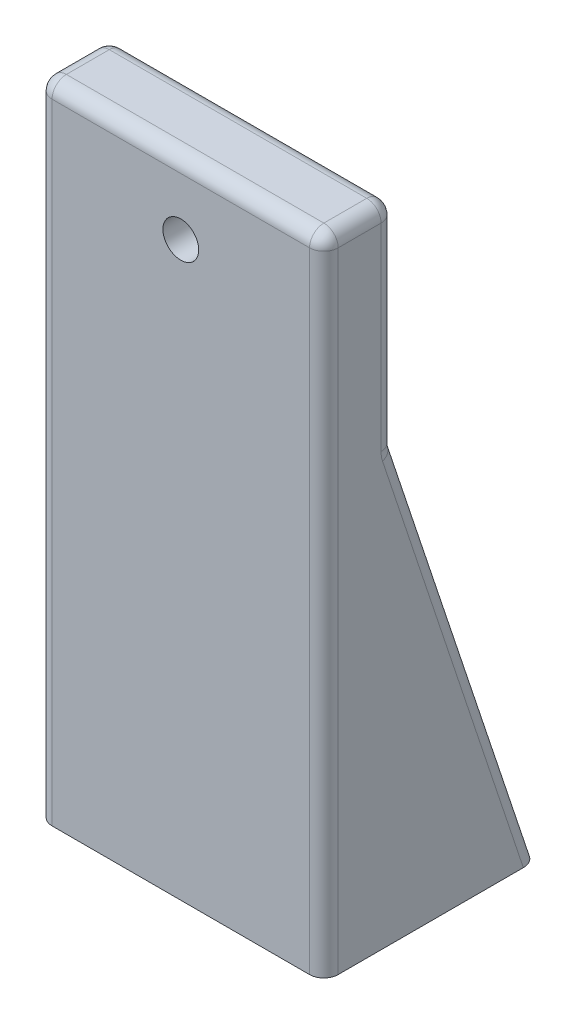
ISO-10303-21;
HEADER;
FILE_DESCRIPTION(('STEP AP214'),'2;1');
FILE_NAME('part.step','',(''),(''),'','','');
FILE_SCHEMA(('AUTOMOTIVE_DESIGN { 1 0 10303 214 1 1 1 1 }'));
ENDSEC;
DATA;
#1=APPLICATION_CONTEXT('core data for automotive mechanical design processes');
#2=APPLICATION_PROTOCOL_DEFINITION('international standard','automotive_design',2000,#1);
#3=PRODUCT_CONTEXT('',#1,'mechanical');
#4=PRODUCT('Part','Part','',(#3));
#5=PRODUCT_RELATED_PRODUCT_CATEGORY('part','',(#4));
#6=PRODUCT_DEFINITION_FORMATION('','',#4);
#7=PRODUCT_DEFINITION_CONTEXT('part definition',#1,'design');
#8=PRODUCT_DEFINITION('design','',#6,#7);
#9=PRODUCT_DEFINITION_SHAPE('','',#8);
#10=(LENGTH_UNIT() NAMED_UNIT(*) SI_UNIT(.MILLI.,.METRE.));
#11=(NAMED_UNIT(*) PLANE_ANGLE_UNIT() SI_UNIT($,.RADIAN.));
#12=(NAMED_UNIT(*) SI_UNIT($,.STERADIAN.) SOLID_ANGLE_UNIT());
#13=UNCERTAINTY_MEASURE_WITH_UNIT(LENGTH_MEASURE(1.E-05),#10,'distance_accuracy_value','');
#14=(GEOMETRIC_REPRESENTATION_CONTEXT(3) GLOBAL_UNCERTAINTY_ASSIGNED_CONTEXT((#13)) GLOBAL_UNIT_ASSIGNED_CONTEXT((#10,
#11,#12)) REPRESENTATION_CONTEXT('',''));
#15=CARTESIAN_POINT('',(0.,0.,0.));
#16=DIRECTION('',(0.,0.,1.));
#17=DIRECTION('',(1.,0.,0.));
#18=AXIS2_PLACEMENT_3D('',#15,#16,#17);
#19=CARTESIAN_POINT('',(0.,0.,6.35));
#20=DIRECTION('',(0.,0.,-1.));
#21=DIRECTION('',(-1.,0.,0.));
#22=AXIS2_PLACEMENT_3D('',#19,#20,#21);
#23=PLANE('',#22);
#24=DIRECTION('',(-1.,0.,0.));
#25=VECTOR('',#24,1.);
#26=CARTESIAN_POINT('',(0.,54.61,6.35));
#27=LINE('',#26,#25);
#28=CARTESIAN_POINT('',(22.86,54.61,6.35));
#29=VERTEX_POINT('',#28);
#30=CARTESIAN_POINT('',(-22.86,54.61,6.35));
#31=VERTEX_POINT('',#30);
#32=EDGE_CURVE('E227',#29,#31,#27,.T.);
#33=ORIENTED_EDGE('',*,*,#32,.T.);
#34=DIRECTION('',(0.,-1.,0.));
#35=VECTOR('',#34,1.);
#36=CARTESIAN_POINT('',(-22.86,0.,6.35));
#37=LINE('',#36,#35);
#38=CARTESIAN_POINT('',(-22.86,-57.15,6.35));
#39=VERTEX_POINT('',#38);
#40=EDGE_CURVE('E230',#31,#39,#37,.T.);
#41=ORIENTED_EDGE('',*,*,#40,.T.);
#42=DIRECTION('',(1.,0.,0.));
#43=VECTOR('',#42,1.);
#44=CARTESIAN_POINT('',(-25.4,-57.15,6.35));
#45=LINE('',#44,#43);
#46=CARTESIAN_POINT('',(22.86,-57.15,6.35));
#47=VERTEX_POINT('',#46);
#48=EDGE_CURVE('E359',#39,#47,#45,.T.);
#49=ORIENTED_EDGE('',*,*,#48,.T.);
#50=DIRECTION('',(0.,1.,0.));
#51=VECTOR('',#50,1.);
#52=CARTESIAN_POINT('',(22.86,0.,6.35));
#53=LINE('',#52,#51);
#54=EDGE_CURVE('E224',#47,#29,#53,.T.);
#55=ORIENTED_EDGE('',*,*,#54,.T.);
#56=EDGE_LOOP('',(#33,#41,#49,#55));
#57=FACE_BOUND('',#56,.T.);
#58=CARTESIAN_POINT('',(0.,44.45,6.35));
#59=DIRECTION('',(0.,0.,1.));
#60=DIRECTION('',(1.,0.,0.));
#61=AXIS2_PLACEMENT_3D('',#58,#59,#60);
#62=CIRCLE('',#61,3.175);
#63=CARTESIAN_POINT('',(3.175,44.45,6.35));
#64=VERTEX_POINT('',#63);
#65=EDGE_CURVE('E355',#64,#64,#62,.T.);
#66=ORIENTED_EDGE('',*,*,#65,.F.);
#67=EDGE_LOOP('',(#66));
#68=FACE_BOUND('',#67,.T.);
#69=ADVANCED_FACE('F44',(#57,#68),#23,.F.);
#70=CARTESIAN_POINT('',(0.,0.,-6.35));
#71=DIRECTION('',(0.,0.,-1.));
#72=DIRECTION('',(-1.,0.,0.));
#73=AXIS2_PLACEMENT_3D('',#70,#71,#72);
#74=PLANE('',#73);
#75=DIRECTION('',(1.,0.,0.));
#76=VECTOR('',#75,1.);
#77=CARTESIAN_POINT('',(-25.4,19.4621852568277,-6.35));
#78=LINE('',#77,#76);
#79=CARTESIAN_POINT('',(22.86,19.4621852568277,-6.35));
#80=VERTEX_POINT('',#79);
#81=CARTESIAN_POINT('',(-22.86,19.4621852568277,-6.35));
#82=VERTEX_POINT('',#81);
#83=EDGE_CURVE('E246',#80,#82,#78,.F.);
#84=ORIENTED_EDGE('',*,*,#83,.T.);
#85=DIRECTION('',(0.,-1.,0.));
#86=VECTOR('',#85,1.);
#87=CARTESIAN_POINT('',(-22.86,57.15,-6.35));
#88=LINE('',#87,#86);
#89=CARTESIAN_POINT('',(-22.86,54.61,-6.35));
#90=VERTEX_POINT('',#89);
#91=EDGE_CURVE('E11',#82,#90,#88,.F.);
#92=ORIENTED_EDGE('',*,*,#91,.T.);
#93=DIRECTION('',(-1.,0.,0.));
#94=VECTOR('',#93,1.);
#95=CARTESIAN_POINT('',(25.4,54.61,-6.35));
#96=LINE('',#95,#94);
#97=CARTESIAN_POINT('',(22.86,54.61,-6.35));
#98=VERTEX_POINT('',#97);
#99=EDGE_CURVE('E54',#90,#98,#96,.F.);
#100=ORIENTED_EDGE('',*,*,#99,.T.);
#101=DIRECTION('',(0.,1.,0.));
#102=VECTOR('',#101,1.);
#103=CARTESIAN_POINT('',(22.86,19.05,-6.35));
#104=LINE('',#103,#102);
#105=EDGE_CURVE('E249',#98,#80,#104,.F.);
#106=ORIENTED_EDGE('',*,*,#105,.T.);
#107=EDGE_LOOP('',(#84,#92,#100,#106));
#108=FACE_BOUND('',#107,.T.);
#109=CARTESIAN_POINT('',(0.,44.45,-6.35));
#110=DIRECTION('',(0.,0.,1.));
#111=DIRECTION('',(1.,0.,0.));
#112=AXIS2_PLACEMENT_3D('',#109,#110,#111);
#113=CIRCLE('',#112,3.175);
#114=CARTESIAN_POINT('',(3.175,44.45,-6.35));
#115=VERTEX_POINT('',#114);
#116=EDGE_CURVE('E171',#115,#115,#113,.T.);
#117=ORIENTED_EDGE('',*,*,#116,.T.);
#118=EDGE_LOOP('',(#117));
#119=FACE_BOUND('',#118,.T.);
#120=ADVANCED_FACE('F384',(#108,#119),#74,.T.);
#121=CARTESIAN_POINT('',(25.4,-57.15,6.35));
#122=DIRECTION('',(-1.,0.,0.));
#123=DIRECTION('',(0.,0.,1.));
#124=AXIS2_PLACEMENT_3D('',#121,#122,#123);
#125=PLANE('',#124);
#126=DIRECTION('',(0.,0.,-1.));
#127=VECTOR('',#126,1.);
#128=CARTESIAN_POINT('',(25.4,54.61,6.35));
#129=LINE('',#128,#127);
#130=CARTESIAN_POINT('',(25.4,54.61,-3.81));
#131=VERTEX_POINT('',#130);
#132=CARTESIAN_POINT('',(25.4,54.61,3.81));
#133=VERTEX_POINT('',#132);
#134=EDGE_CURVE('E211',#131,#133,#129,.F.);
#135=ORIENTED_EDGE('',*,*,#134,.T.);
#136=DIRECTION('',(0.,1.,0.));
#137=VECTOR('',#136,1.);
#138=CARTESIAN_POINT('',(25.4,-57.15,3.81));
#139=LINE('',#138,#137);
#140=CARTESIAN_POINT('',(25.4,-57.15,3.81));
#141=VERTEX_POINT('',#140);
#142=EDGE_CURVE('E221',#133,#141,#139,.F.);
#143=ORIENTED_EDGE('',*,*,#142,.T.);
#144=DIRECTION('',(0.,0.,-1.));
#145=VECTOR('',#144,1.);
#146=CARTESIAN_POINT('',(25.4,-57.15,6.35));
#147=LINE('',#146,#145);
#148=CARTESIAN_POINT('',(25.4,-57.15,-29.0726049143908));
#149=VERTEX_POINT('',#148);
#150=EDGE_CURVE('E366',#141,#149,#147,.T.);
#151=ORIENTED_EDGE('',*,*,#150,.T.);
#152=DIRECTION('',(0.,0.948683298050514,0.316227766016838));
#153=VECTOR('',#152,1.);
#154=CARTESIAN_POINT('',(25.4,18.2467814743172,-3.94034442295169));
#155=LINE('',#154,#153);
#156=CARTESIAN_POINT('',(25.4,17.8557482054622,-4.07068884590338));
#157=VERTEX_POINT('',#156);
#158=EDGE_CURVE('E218',#149,#157,#155,.T.);
#159=ORIENTED_EDGE('',*,*,#158,.T.);
#160=CARTESIAN_POINT('',(25.4,19.4621852568277,-8.89));
#161=DIRECTION('',(-1.,0.,0.));
#162=DIRECTION('',(0.,0.,1.));
#163=AXIS2_PLACEMENT_3D('',#160,#161,#162);
#164=CIRCLE('',#163,5.08);
#165=CARTESIAN_POINT('',(25.4,19.4621852568277,-3.81));
#166=VERTEX_POINT('',#165);
#167=EDGE_CURVE('E214',#166,#157,#164,.F.);
#168=ORIENTED_EDGE('',*,*,#167,.F.);
#169=DIRECTION('',(0.,1.,0.));
#170=VECTOR('',#169,1.);
#171=CARTESIAN_POINT('',(25.4,57.15,-3.81));
#172=LINE('',#171,#170);
#173=EDGE_CURVE('E161',#166,#131,#172,.T.);
#174=ORIENTED_EDGE('',*,*,#173,.T.);
#175=EDGE_LOOP('',(#135,#143,#151,#159,#168,#174));
#176=FACE_BOUND('',#175,.T.);
#177=ADVANCED_FACE('F416',(#176),#125,.F.);
#178=CARTESIAN_POINT('',(-25.4,57.15,6.35));
#179=DIRECTION('',(0.,-1.,0.));
#180=DIRECTION('',(0.,0.,-1.));
#181=AXIS2_PLACEMENT_3D('',#178,#179,#180);
#182=PLANE('',#181);
#183=DIRECTION('',(0.,0.,-1.));
#184=VECTOR('',#183,1.);
#185=CARTESIAN_POINT('',(-22.86,57.15,6.35));
#186=LINE('',#185,#184);
#187=CARTESIAN_POINT('',(-22.86,57.15,-3.81));
#188=VERTEX_POINT('',#187);
#189=CARTESIAN_POINT('',(-22.86,57.15,3.81));
#190=VERTEX_POINT('',#189);
#191=EDGE_CURVE('E239',#188,#190,#186,.F.);
#192=ORIENTED_EDGE('',*,*,#191,.T.);
#193=DIRECTION('',(-1.,0.,0.));
#194=VECTOR('',#193,1.);
#195=CARTESIAN_POINT('',(-25.4,57.15,3.81));
#196=LINE('',#195,#194);
#197=CARTESIAN_POINT('',(22.86,57.15,3.81));
#198=VERTEX_POINT('',#197);
#199=EDGE_CURVE('E243',#190,#198,#196,.F.);
#200=ORIENTED_EDGE('',*,*,#199,.T.);
#201=DIRECTION('',(0.,0.,-1.));
#202=VECTOR('',#201,1.);
#203=CARTESIAN_POINT('',(22.86,57.15,6.35));
#204=LINE('',#203,#202);
#205=CARTESIAN_POINT('',(22.86,57.15,-3.81));
#206=VERTEX_POINT('',#205);
#207=EDGE_CURVE('E236',#198,#206,#204,.T.);
#208=ORIENTED_EDGE('',*,*,#207,.T.);
#209=DIRECTION('',(-1.,0.,0.));
#210=VECTOR('',#209,1.);
#211=CARTESIAN_POINT('',(-25.4,57.15,-3.81));
#212=LINE('',#211,#210);
#213=EDGE_CURVE('E233',#206,#188,#212,.T.);
#214=ORIENTED_EDGE('',*,*,#213,.T.);
#215=EDGE_LOOP('',(#192,#200,#208,#214));
#216=FACE_BOUND('',#215,.T.);
#217=ADVANCED_FACE('F420',(#216),#182,.F.);
#218=CARTESIAN_POINT('',(-25.4,-57.15,6.35));
#219=DIRECTION('',(1.,0.,0.));
#220=DIRECTION('',(0.,0.,-1.));
#221=AXIS2_PLACEMENT_3D('',#218,#219,#220);
#222=PLANE('',#221);
#223=CARTESIAN_POINT('',(-25.4,19.4621852568277,-8.89));
#224=DIRECTION('',(1.,0.,0.));
#225=DIRECTION('',(0.,0.,-1.));
#226=AXIS2_PLACEMENT_3D('',#223,#224,#225);
#227=CIRCLE('',#226,5.08);
#228=CARTESIAN_POINT('',(-25.4,17.8557482054622,-4.07068884590339));
#229=VERTEX_POINT('',#228);
#230=CARTESIAN_POINT('',(-25.4,19.4621852568277,-3.81));
#231=VERTEX_POINT('',#230);
#232=EDGE_CURVE('E179',#229,#231,#227,.F.);
#233=ORIENTED_EDGE('',*,*,#232,.F.);
#234=DIRECTION('',(0.,0.948683298050514,0.316227766016838));
#235=VECTOR('',#234,1.);
#236=CARTESIAN_POINT('',(-25.4,-57.9532185256828,-29.3403444229517));
#237=LINE('',#236,#235);
#238=CARTESIAN_POINT('',(-25.4,-57.15,-29.0726049143908));
#239=VERTEX_POINT('',#238);
#240=EDGE_CURVE('E198',#229,#239,#237,.F.);
#241=ORIENTED_EDGE('',*,*,#240,.T.);
#242=DIRECTION('',(0.,0.,-1.));
#243=VECTOR('',#242,1.);
#244=CARTESIAN_POINT('',(-25.4,-57.15,6.35));
#245=LINE('',#244,#243);
#246=CARTESIAN_POINT('',(-25.4,-57.15,3.81));
#247=VERTEX_POINT('',#246);
#248=EDGE_CURVE('E156',#247,#239,#245,.T.);
#249=ORIENTED_EDGE('',*,*,#248,.F.);
#250=DIRECTION('',(0.,-1.,0.));
#251=VECTOR('',#250,1.);
#252=CARTESIAN_POINT('',(-25.4,-57.15,3.81));
#253=LINE('',#252,#251);
#254=CARTESIAN_POINT('',(-25.4,54.61,3.81));
#255=VERTEX_POINT('',#254);
#256=EDGE_CURVE('E195',#247,#255,#253,.F.);
#257=ORIENTED_EDGE('',*,*,#256,.T.);
#258=DIRECTION('',(0.,0.,-1.));
#259=VECTOR('',#258,1.);
#260=CARTESIAN_POINT('',(-25.4,54.61,6.35));
#261=LINE('',#260,#259);
#262=CARTESIAN_POINT('',(-25.4,54.61,-3.81));
#263=VERTEX_POINT('',#262);
#264=EDGE_CURVE('E192',#255,#263,#261,.T.);
#265=ORIENTED_EDGE('',*,*,#264,.T.);
#266=DIRECTION('',(0.,-1.,0.));
#267=VECTOR('',#266,1.);
#268=CARTESIAN_POINT('',(-25.4,19.05,-3.81));
#269=LINE('',#268,#267);
#270=EDGE_CURVE('E184',#263,#231,#269,.T.);
#271=ORIENTED_EDGE('',*,*,#270,.T.);
#272=EDGE_LOOP('',(#233,#241,#249,#257,#265,#271));
#273=FACE_BOUND('',#272,.T.);
#274=ADVANCED_FACE('F393',(#273),#222,.F.);
#275=CARTESIAN_POINT('',(-25.4,-57.15,6.35));
#276=DIRECTION('',(0.,1.,0.));
#277=DIRECTION('',(0.,0.,1.));
#278=AXIS2_PLACEMENT_3D('',#275,#276,#277);
#279=PLANE('',#278);
#280=CARTESIAN_POINT('',(15.24,-57.15,0.));
#281=DIRECTION('',(0.,-1.,0.));
#282=DIRECTION('',(0.,0.,-1.));
#283=AXIS2_PLACEMENT_3D('',#280,#281,#282);
#284=CIRCLE('',#283,1.5);
#285=CARTESIAN_POINT('',(15.24,-57.15,-1.49999999999999));
#286=VERTEX_POINT('',#285);
#287=EDGE_CURVE('E333',#286,#286,#284,.T.);
#288=ORIENTED_EDGE('',*,*,#287,.F.);
#289=EDGE_LOOP('',(#288));
#290=FACE_BOUND('',#289,.T.);
#291=CARTESIAN_POINT('',(-15.24,-57.15,-22.86));
#292=DIRECTION('',(0.,-1.,0.));
#293=DIRECTION('',(0.,0.,-1.));
#294=AXIS2_PLACEMENT_3D('',#291,#292,#293);
#295=CIRCLE('',#294,1.5);
#296=CARTESIAN_POINT('',(-15.24,-57.15,-24.36));
#297=VERTEX_POINT('',#296);
#298=EDGE_CURVE('E342',#297,#297,#295,.T.);
#299=ORIENTED_EDGE('',*,*,#298,.F.);
#300=EDGE_LOOP('',(#299));
#301=FACE_BOUND('',#300,.T.);
#302=CARTESIAN_POINT('',(15.24,-57.15,-22.86));
#303=DIRECTION('',(0.,-1.,0.));
#304=DIRECTION('',(0.,0.,-1.));
#305=AXIS2_PLACEMENT_3D('',#302,#303,#304);
#306=CIRCLE('',#305,1.5);
#307=CARTESIAN_POINT('',(15.24,-57.15,-24.36));
#308=VERTEX_POINT('',#307);
#309=EDGE_CURVE('E324',#308,#308,#306,.T.);
#310=ORIENTED_EDGE('',*,*,#309,.F.);
#311=EDGE_LOOP('',(#310));
#312=FACE_BOUND('',#311,.T.);
#313=CARTESIAN_POINT('',(-15.24,-57.15,0.));
#314=DIRECTION('',(0.,-1.,0.));
#315=DIRECTION('',(0.,0.,-1.));
#316=AXIS2_PLACEMENT_3D('',#313,#314,#315);
#317=CIRCLE('',#316,1.5);
#318=CARTESIAN_POINT('',(-15.24,-57.15,-1.5));
#319=VERTEX_POINT('',#318);
#320=EDGE_CURVE('E337',#319,#319,#317,.T.);
#321=ORIENTED_EDGE('',*,*,#320,.F.);
#322=EDGE_LOOP('',(#321));
#323=FACE_BOUND('',#322,.T.);
#324=ORIENTED_EDGE('',*,*,#248,.T.);
#325=CARTESIAN_POINT('',(-22.86,-57.15,-29.0726049143908));
#326=DIRECTION('',(0.,1.,0.));
#327=DIRECTION('',(0.,0.,-1.));
#328=AXIS2_PLACEMENT_3D('',#325,#326,#327);
#329=ELLIPSE('',#328,2.67739508560923,2.54);
#330=CARTESIAN_POINT('',(-22.86,-57.15,-31.75));
#331=VERTEX_POINT('',#330);
#332=EDGE_CURVE('E150',#239,#331,#329,.F.);
#333=ORIENTED_EDGE('',*,*,#332,.T.);
#334=DIRECTION('',(1.,0.,0.));
#335=VECTOR('',#334,1.);
#336=CARTESIAN_POINT('',(-25.4,-57.15,-31.75));
#337=LINE('',#336,#335);
#338=CARTESIAN_POINT('',(22.86,-57.15,-31.75));
#339=VERTEX_POINT('',#338);
#340=EDGE_CURVE('E153',#331,#339,#337,.T.);
#341=ORIENTED_EDGE('',*,*,#340,.T.);
#342=CARTESIAN_POINT('',(22.86,-57.15,-29.0726049143908));
#343=DIRECTION('',(0.,1.,0.));
#344=DIRECTION('',(0.,0.,-1.));
#345=AXIS2_PLACEMENT_3D('',#342,#343,#344);
#346=ELLIPSE('',#345,2.67739508560923,2.54);
#347=EDGE_CURVE('E162',#339,#149,#346,.F.);
#348=ORIENTED_EDGE('',*,*,#347,.T.);
#349=ORIENTED_EDGE('',*,*,#150,.F.);
#350=CARTESIAN_POINT('',(22.86,-57.15,3.81));
#351=DIRECTION('',(0.,1.,0.));
#352=DIRECTION('',(0.,0.,1.));
#353=AXIS2_PLACEMENT_3D('',#350,#351,#352);
#354=CIRCLE('',#353,2.54);
#355=EDGE_CURVE('E201',#141,#47,#354,.F.);
#356=ORIENTED_EDGE('',*,*,#355,.T.);
#357=ORIENTED_EDGE('',*,*,#48,.F.);
#358=CARTESIAN_POINT('',(-22.86,-57.15,3.81));
#359=DIRECTION('',(0.,1.,0.));
#360=DIRECTION('',(0.,0.,1.));
#361=AXIS2_PLACEMENT_3D('',#358,#359,#360);
#362=CIRCLE('',#361,2.54);
#363=EDGE_CURVE('E204',#39,#247,#362,.F.);
#364=ORIENTED_EDGE('',*,*,#363,.T.);
#365=EDGE_LOOP('',(#324,#333,#341,#348,#349,#356,#357,#364));
#366=FACE_BOUND('',#365,.T.);
#367=ADVANCED_FACE('F152',(#290,#301,#312,#323,#366),#279,.F.);
#368=CARTESIAN_POINT('',(0.,44.45,6.35));
#369=DIRECTION('',(0.,0.,-1.));
#370=DIRECTION('',(-1.,0.,0.));
#371=AXIS2_PLACEMENT_3D('',#368,#369,#370);
#372=CYLINDRICAL_SURFACE('',#371,3.175);
#373=ORIENTED_EDGE('',*,*,#65,.T.);
#374=EDGE_LOOP('',(#373));
#375=FACE_BOUND('',#374,.T.);
#376=ORIENTED_EDGE('',*,*,#116,.F.);
#377=EDGE_LOOP('',(#376));
#378=FACE_BOUND('',#377,.T.);
#379=ADVANCED_FACE('F445',(#375,#378),#372,.F.);
#380=CARTESIAN_POINT('',(-25.4,-57.15,-31.75));
#381=DIRECTION('',(0.,0.316227766016838,-0.948683298050514));
#382=DIRECTION('',(0.,0.948683298050514,0.316227766016838));
#383=AXIS2_PLACEMENT_3D('',#380,#381,#382);
#384=PLANE('',#383);
#385=ORIENTED_EDGE('',*,*,#340,.F.);
#386=DIRECTION('',(0.,0.948683298050514,0.316227766016838));
#387=VECTOR('',#386,1.);
#388=CARTESIAN_POINT('',(-22.86,19.05,-6.35));
#389=LINE('',#388,#387);
#390=CARTESIAN_POINT('',(-22.86,18.6589667311449,-6.4803444229517));
#391=VERTEX_POINT('',#390);
#392=EDGE_CURVE('E167',#331,#391,#389,.T.);
#393=ORIENTED_EDGE('',*,*,#392,.T.);
#394=DIRECTION('',(1.,0.,0.));
#395=VECTOR('',#394,1.);
#396=CARTESIAN_POINT('',(25.4,18.6589667311449,-6.48034442295169));
#397=LINE('',#396,#395);
#398=CARTESIAN_POINT('',(22.86,18.6589667311449,-6.4803444229517));
#399=VERTEX_POINT('',#398);
#400=EDGE_CURVE('E186',#391,#399,#397,.T.);
#401=ORIENTED_EDGE('',*,*,#400,.T.);
#402=DIRECTION('',(0.,0.948683298050514,0.316227766016838));
#403=VECTOR('',#402,1.);
#404=CARTESIAN_POINT('',(22.86,-57.15,-31.75));
#405=LINE('',#404,#403);
#406=EDGE_CURVE('E169',#399,#339,#405,.F.);
#407=ORIENTED_EDGE('',*,*,#406,.T.);
#408=EDGE_LOOP('',(#385,#393,#401,#407));
#409=FACE_BOUND('',#408,.T.);
#410=ADVANCED_FACE('F166',(#409),#384,.T.);
#411=CARTESIAN_POINT('',(-15.24,-44.45,0.));
#412=DIRECTION('',(0.,-1.,0.));
#413=DIRECTION('',(0.,0.,-1.));
#414=AXIS2_PLACEMENT_3D('',#411,#412,#413);
#415=CYLINDRICAL_SURFACE('',#414,1.5);
#416=CARTESIAN_POINT('',(-15.24,-44.45,0.));
#417=DIRECTION('',(0.,-1.,0.));
#418=DIRECTION('',(0.,0.,-1.));
#419=AXIS2_PLACEMENT_3D('',#416,#417,#418);
#420=CIRCLE('',#419,1.5);
#421=CARTESIAN_POINT('',(-15.24,-44.45,-1.5));
#422=VERTEX_POINT('',#421);
#423=EDGE_CURVE('E172',#422,#422,#420,.T.);
#424=ORIENTED_EDGE('',*,*,#423,.F.);
#425=EDGE_LOOP('',(#424));
#426=FACE_BOUND('',#425,.T.);
#427=ORIENTED_EDGE('',*,*,#320,.T.);
#428=EDGE_LOOP('',(#427));
#429=FACE_BOUND('',#428,.T.);
#430=ADVANCED_FACE('F644',(#426,#429),#415,.F.);
#431=CARTESIAN_POINT('',(-15.24,-44.45,0.));
#432=DIRECTION('',(0.,-1.,0.));
#433=DIRECTION('',(0.,0.,-1.));
#434=AXIS2_PLACEMENT_3D('',#431,#432,#433);
#435=PLANE('',#434);
#436=ORIENTED_EDGE('',*,*,#423,.T.);
#437=EDGE_LOOP('',(#436));
#438=FACE_BOUND('',#437,.T.);
#439=ADVANCED_FACE('F635',(#438),#435,.T.);
#440=CARTESIAN_POINT('',(15.24,-44.45,-22.86));
#441=DIRECTION('',(0.,-1.,0.));
#442=DIRECTION('',(0.,0.,-1.));
#443=AXIS2_PLACEMENT_3D('',#440,#441,#442);
#444=CYLINDRICAL_SURFACE('',#443,1.5);
#445=CARTESIAN_POINT('',(15.24,-44.45,-22.86));
#446=DIRECTION('',(0.,-1.,0.));
#447=DIRECTION('',(0.,0.,-1.));
#448=AXIS2_PLACEMENT_3D('',#445,#446,#447);
#449=CIRCLE('',#448,1.5);
#450=CARTESIAN_POINT('',(15.24,-44.45,-24.36));
#451=VERTEX_POINT('',#450);
#452=EDGE_CURVE('E318',#451,#451,#449,.T.);
#453=ORIENTED_EDGE('',*,*,#452,.F.);
#454=EDGE_LOOP('',(#453));
#455=FACE_BOUND('',#454,.T.);
#456=ORIENTED_EDGE('',*,*,#309,.T.);
#457=EDGE_LOOP('',(#456));
#458=FACE_BOUND('',#457,.T.);
#459=ADVANCED_FACE('F627',(#455,#458),#444,.F.);
#460=CARTESIAN_POINT('',(15.24,-44.45,-22.86));
#461=DIRECTION('',(0.,-1.,0.));
#462=DIRECTION('',(0.,0.,-1.));
#463=AXIS2_PLACEMENT_3D('',#460,#461,#462);
#464=PLANE('',#463);
#465=ORIENTED_EDGE('',*,*,#452,.T.);
#466=EDGE_LOOP('',(#465));
#467=FACE_BOUND('',#466,.T.);
#468=ADVANCED_FACE('F618',(#467),#464,.T.);
#469=CARTESIAN_POINT('',(-15.24,-44.45,-22.86));
#470=DIRECTION('',(0.,-1.,0.));
#471=DIRECTION('',(0.,0.,-1.));
#472=AXIS2_PLACEMENT_3D('',#469,#470,#471);
#473=CYLINDRICAL_SURFACE('',#472,1.5);
#474=CARTESIAN_POINT('',(-15.24,-44.45,-22.86));
#475=DIRECTION('',(0.,-1.,0.));
#476=DIRECTION('',(0.,0.,-1.));
#477=AXIS2_PLACEMENT_3D('',#474,#475,#476);
#478=CIRCLE('',#477,1.5);
#479=CARTESIAN_POINT('',(-15.24,-44.45,-24.36));
#480=VERTEX_POINT('',#479);
#481=EDGE_CURVE('E330',#480,#480,#478,.T.);
#482=ORIENTED_EDGE('',*,*,#481,.F.);
#483=EDGE_LOOP('',(#482));
#484=FACE_BOUND('',#483,.T.);
#485=ORIENTED_EDGE('',*,*,#298,.T.);
#486=EDGE_LOOP('',(#485));
#487=FACE_BOUND('',#486,.T.);
#488=ADVANCED_FACE('F609',(#484,#487),#473,.F.);
#489=CARTESIAN_POINT('',(-15.24,-44.45,-22.86));
#490=DIRECTION('',(0.,-1.,0.));
#491=DIRECTION('',(0.,0.,-1.));
#492=AXIS2_PLACEMENT_3D('',#489,#490,#491);
#493=PLANE('',#492);
#494=ORIENTED_EDGE('',*,*,#481,.T.);
#495=EDGE_LOOP('',(#494));
#496=FACE_BOUND('',#495,.T.);
#497=ADVANCED_FACE('F600',(#496),#493,.T.);
#498=CARTESIAN_POINT('',(15.24,-44.45,0.));
#499=DIRECTION('',(0.,-1.,0.));
#500=DIRECTION('',(0.,0.,-1.));
#501=AXIS2_PLACEMENT_3D('',#498,#499,#500);
#502=CYLINDRICAL_SURFACE('',#501,1.5);
#503=CARTESIAN_POINT('',(15.24,-44.45,0.));
#504=DIRECTION('',(0.,-1.,0.));
#505=DIRECTION('',(0.,0.,-1.));
#506=AXIS2_PLACEMENT_3D('',#503,#504,#505);
#507=CIRCLE('',#506,1.5);
#508=CARTESIAN_POINT('',(15.24,-44.45,-1.49999999999999));
#509=VERTEX_POINT('',#508);
#510=EDGE_CURVE('E338',#509,#509,#507,.T.);
#511=ORIENTED_EDGE('',*,*,#510,.F.);
#512=EDGE_LOOP('',(#511));
#513=FACE_BOUND('',#512,.T.);
#514=ORIENTED_EDGE('',*,*,#287,.T.);
#515=EDGE_LOOP('',(#514));
#516=FACE_BOUND('',#515,.T.);
#517=ADVANCED_FACE('F591',(#513,#516),#502,.F.);
#518=CARTESIAN_POINT('',(15.24,-44.45,0.));
#519=DIRECTION('',(0.,-1.,0.));
#520=DIRECTION('',(0.,0.,-1.));
#521=AXIS2_PLACEMENT_3D('',#518,#519,#520);
#522=PLANE('',#521);
#523=ORIENTED_EDGE('',*,*,#510,.T.);
#524=EDGE_LOOP('',(#523));
#525=FACE_BOUND('',#524,.T.);
#526=ADVANCED_FACE('F433',(#525),#522,.T.);
#527=CARTESIAN_POINT('',(22.86,0.,3.81));
#528=DIRECTION('',(0.,1.,0.));
#529=DIRECTION('',(0.,0.,1.));
#530=AXIS2_PLACEMENT_3D('',#527,#528,#529);
#531=CYLINDRICAL_SURFACE('',#530,2.54);
#532=CARTESIAN_POINT('',(22.86,54.61,3.81));
#533=DIRECTION('',(0.,1.,0.));
#534=DIRECTION('',(0.,0.,1.));
#535=AXIS2_PLACEMENT_3D('',#532,#533,#534);
#536=CIRCLE('',#535,2.54);
#537=EDGE_CURVE('E48',#29,#133,#536,.T.);
#538=ORIENTED_EDGE('',*,*,#537,.F.);
#539=ORIENTED_EDGE('',*,*,#54,.F.);
#540=ORIENTED_EDGE('',*,*,#355,.F.);
#541=ORIENTED_EDGE('',*,*,#142,.F.);
#542=EDGE_LOOP('',(#538,#539,#540,#541));
#543=FACE_BOUND('',#542,.T.);
#544=ADVANCED_FACE('F46',(#543),#531,.T.);
#545=CARTESIAN_POINT('',(22.86,54.61,3.81));
#546=DIRECTION('',(1.,0.,0.));
#547=DIRECTION('',(0.,0.,-1.));
#548=AXIS2_PLACEMENT_3D('',#545,#546,#547);
#549=SPHERICAL_SURFACE('',#548,2.54);
#550=CARTESIAN_POINT('',(22.86,54.61,3.81));
#551=DIRECTION('',(1.,0.,0.));
#552=DIRECTION('',(0.,0.,-1.));
#553=AXIS2_PLACEMENT_3D('',#550,#551,#552);
#554=CIRCLE('',#553,2.54);
#555=EDGE_CURVE('E306',#29,#198,#554,.F.);
#556=ORIENTED_EDGE('',*,*,#555,.F.);
#557=ORIENTED_EDGE('',*,*,#537,.T.);
#558=CARTESIAN_POINT('',(22.86,54.61,3.81));
#559=DIRECTION('',(0.,0.,1.));
#560=DIRECTION('',(1.,0.,0.));
#561=AXIS2_PLACEMENT_3D('',#558,#559,#560);
#562=CIRCLE('',#561,2.54);
#563=EDGE_CURVE('E309',#198,#133,#562,.F.);
#564=ORIENTED_EDGE('',*,*,#563,.F.);
#565=EDGE_LOOP('',(#556,#557,#564));
#566=FACE_BOUND('',#565,.T.);
#567=ADVANCED_FACE('F426',(#566),#549,.T.);
#568=CARTESIAN_POINT('',(22.86,54.61,6.35));
#569=DIRECTION('',(0.,0.,-1.));
#570=DIRECTION('',(-1.,0.,0.));
#571=AXIS2_PLACEMENT_3D('',#568,#569,#570);
#572=CYLINDRICAL_SURFACE('',#571,2.54);
#573=ORIENTED_EDGE('',*,*,#563,.T.);
#574=ORIENTED_EDGE('',*,*,#134,.F.);
#575=CARTESIAN_POINT('',(22.86,54.61,-3.81));
#576=DIRECTION('',(0.,0.,-1.));
#577=DIRECTION('',(-1.,0.,0.));
#578=AXIS2_PLACEMENT_3D('',#575,#576,#577);
#579=CIRCLE('',#578,2.54);
#580=EDGE_CURVE('E302',#206,#131,#579,.T.);
#581=ORIENTED_EDGE('',*,*,#580,.F.);
#582=ORIENTED_EDGE('',*,*,#207,.F.);
#583=EDGE_LOOP('',(#573,#574,#581,#582));
#584=FACE_BOUND('',#583,.T.);
#585=ADVANCED_FACE('F418',(#584),#572,.T.);
#586=CARTESIAN_POINT('',(0.,54.61,3.81));
#587=DIRECTION('',(-1.,0.,0.));
#588=DIRECTION('',(0.,0.,1.));
#589=AXIS2_PLACEMENT_3D('',#586,#587,#588);
#590=CYLINDRICAL_SURFACE('',#589,2.54);
#591=ORIENTED_EDGE('',*,*,#555,.T.);
#592=ORIENTED_EDGE('',*,*,#199,.F.);
#593=CARTESIAN_POINT('',(-22.86,54.61,3.81));
#594=DIRECTION('',(-1.,0.,0.));
#595=DIRECTION('',(0.,0.,1.));
#596=AXIS2_PLACEMENT_3D('',#593,#594,#595);
#597=CIRCLE('',#596,2.54);
#598=EDGE_CURVE('E298',#31,#190,#597,.T.);
#599=ORIENTED_EDGE('',*,*,#598,.F.);
#600=ORIENTED_EDGE('',*,*,#32,.F.);
#601=EDGE_LOOP('',(#591,#592,#599,#600));
#602=FACE_BOUND('',#601,.T.);
#603=ADVANCED_FACE('F425',(#602),#590,.T.);
#604=CARTESIAN_POINT('',(-22.86,0.,3.81));
#605=DIRECTION('',(0.,-1.,0.));
#606=DIRECTION('',(0.,0.,-1.));
#607=AXIS2_PLACEMENT_3D('',#604,#605,#606);
#608=CYLINDRICAL_SURFACE('',#607,2.54);
#609=ORIENTED_EDGE('',*,*,#363,.F.);
#610=ORIENTED_EDGE('',*,*,#40,.F.);
#611=CARTESIAN_POINT('',(-22.86,54.61,3.81));
#612=DIRECTION('',(0.,1.,0.));
#613=DIRECTION('',(0.,0.,1.));
#614=AXIS2_PLACEMENT_3D('',#611,#612,#613);
#615=CIRCLE('',#614,2.54);
#616=EDGE_CURVE('E294',#255,#31,#615,.T.);
#617=ORIENTED_EDGE('',*,*,#616,.F.);
#618=ORIENTED_EDGE('',*,*,#256,.F.);
#619=EDGE_LOOP('',(#609,#610,#617,#618));
#620=FACE_BOUND('',#619,.T.);
#621=ADVANCED_FACE('F483',(#620),#608,.T.);
#622=CARTESIAN_POINT('',(22.86,54.61,-3.81));
#623=DIRECTION('',(1.,0.,0.));
#624=DIRECTION('',(0.,0.,-1.));
#625=AXIS2_PLACEMENT_3D('',#622,#623,#624);
#626=SPHERICAL_SURFACE('',#625,2.54);
#627=CARTESIAN_POINT('',(22.86,54.61,-3.81));
#628=DIRECTION('',(1.,0.,0.));
#629=DIRECTION('',(0.,0.,-1.));
#630=AXIS2_PLACEMENT_3D('',#627,#628,#629);
#631=CIRCLE('',#630,2.54);
#632=EDGE_CURVE('E287',#206,#98,#631,.F.);
#633=ORIENTED_EDGE('',*,*,#632,.F.);
#634=ORIENTED_EDGE('',*,*,#580,.T.);
#635=CARTESIAN_POINT('',(22.86,54.61,-3.81));
#636=DIRECTION('',(0.,1.,0.));
#637=DIRECTION('',(0.,0.,1.));
#638=AXIS2_PLACEMENT_3D('',#635,#636,#637);
#639=CIRCLE('',#638,2.54);
#640=EDGE_CURVE('E290',#98,#131,#639,.F.);
#641=ORIENTED_EDGE('',*,*,#640,.F.);
#642=EDGE_LOOP('',(#633,#634,#641));
#643=FACE_BOUND('',#642,.T.);
#644=ADVANCED_FACE('F410',(#643),#626,.T.);
#645=CARTESIAN_POINT('',(-22.86,54.61,3.81));
#646=DIRECTION('',(0.,0.,1.));
#647=DIRECTION('',(1.,0.,0.));
#648=AXIS2_PLACEMENT_3D('',#645,#646,#647);
#649=SPHERICAL_SURFACE('',#648,2.54);
#650=ORIENTED_EDGE('',*,*,#616,.T.);
#651=ORIENTED_EDGE('',*,*,#598,.T.);
#652=CARTESIAN_POINT('',(-22.86,54.61,3.81));
#653=DIRECTION('',(0.,0.,1.));
#654=DIRECTION('',(1.,0.,0.));
#655=AXIS2_PLACEMENT_3D('',#652,#653,#654);
#656=CIRCLE('',#655,2.54);
#657=EDGE_CURVE('E284',#255,#190,#656,.F.);
#658=ORIENTED_EDGE('',*,*,#657,.F.);
#659=EDGE_LOOP('',(#650,#651,#658));
#660=FACE_BOUND('',#659,.T.);
#661=ADVANCED_FACE('F477',(#660),#649,.T.);
#662=CARTESIAN_POINT('',(22.86,-46.5232185256828,-25.5303444229517));
#663=DIRECTION('',(0.,-0.948683298050514,-0.316227766016838));
#664=DIRECTION('',(0.,0.316227766016838,-0.948683298050514));
#665=AXIS2_PLACEMENT_3D('',#662,#663,#664);
#666=CYLINDRICAL_SURFACE('',#665,2.54);
#667=ORIENTED_EDGE('',*,*,#347,.F.);
#668=ORIENTED_EDGE('',*,*,#406,.F.);
#669=CARTESIAN_POINT('',(22.86,17.8557482054622,-4.07068884590338));
#670=DIRECTION('',(0.,0.948683298050514,0.316227766016839));
#671=DIRECTION('',(0.,-0.316227766016839,0.948683298050514));
#672=AXIS2_PLACEMENT_3D('',#669,#670,#671);
#673=CIRCLE('',#672,2.54);
#674=EDGE_CURVE('E280',#157,#399,#673,.T.);
#675=ORIENTED_EDGE('',*,*,#674,.F.);
#676=ORIENTED_EDGE('',*,*,#158,.F.);
#677=EDGE_LOOP('',(#667,#668,#675,#676));
#678=FACE_BOUND('',#677,.T.);
#679=ADVANCED_FACE('F377',(#678),#666,.T.);
#680=CARTESIAN_POINT('',(22.86,-57.15,-3.81));
#681=DIRECTION('',(0.,-1.,0.));
#682=DIRECTION('',(0.,0.,-1.));
#683=AXIS2_PLACEMENT_3D('',#680,#681,#682);
#684=CYLINDRICAL_SURFACE('',#683,2.54);
#685=ORIENTED_EDGE('',*,*,#640,.T.);
#686=ORIENTED_EDGE('',*,*,#173,.F.);
#687=CARTESIAN_POINT('',(22.86,19.4621852568277,-3.81));
#688=DIRECTION('',(0.,-1.,0.));
#689=DIRECTION('',(0.,0.,-1.));
#690=AXIS2_PLACEMENT_3D('',#687,#688,#689);
#691=CIRCLE('',#690,2.54);
#692=EDGE_CURVE('E276',#80,#166,#691,.T.);
#693=ORIENTED_EDGE('',*,*,#692,.F.);
#694=ORIENTED_EDGE('',*,*,#105,.F.);
#695=EDGE_LOOP('',(#685,#686,#693,#694));
#696=FACE_BOUND('',#695,.T.);
#697=ADVANCED_FACE('F414',(#696),#684,.T.);
#698=CARTESIAN_POINT('',(-25.4,54.61,-3.81));
#699=DIRECTION('',(1.,0.,0.));
#700=DIRECTION('',(0.,0.,-1.));
#701=AXIS2_PLACEMENT_3D('',#698,#699,#700);
#702=CYLINDRICAL_SURFACE('',#701,2.54);
#703=ORIENTED_EDGE('',*,*,#632,.T.);
#704=ORIENTED_EDGE('',*,*,#99,.F.);
#705=CARTESIAN_POINT('',(-22.86,54.61,-3.81));
#706=DIRECTION('',(-1.,0.,0.));
#707=DIRECTION('',(0.,0.,1.));
#708=AXIS2_PLACEMENT_3D('',#705,#706,#707);
#709=CIRCLE('',#708,2.54);
#710=EDGE_CURVE('E273',#188,#90,#709,.T.);
#711=ORIENTED_EDGE('',*,*,#710,.F.);
#712=ORIENTED_EDGE('',*,*,#213,.F.);
#713=EDGE_LOOP('',(#703,#704,#711,#712));
#714=FACE_BOUND('',#713,.T.);
#715=ADVANCED_FACE('F406',(#714),#702,.T.);
#716=CARTESIAN_POINT('',(-22.86,54.61,6.35));
#717=DIRECTION('',(0.,0.,-1.));
#718=DIRECTION('',(-1.,0.,0.));
#719=AXIS2_PLACEMENT_3D('',#716,#717,#718);
#720=CYLINDRICAL_SURFACE('',#719,2.54);
#721=ORIENTED_EDGE('',*,*,#657,.T.);
#722=ORIENTED_EDGE('',*,*,#191,.F.);
#723=CARTESIAN_POINT('',(-22.86,54.61,-3.81));
#724=DIRECTION('',(0.,0.,-1.));
#725=DIRECTION('',(-1.,0.,0.));
#726=AXIS2_PLACEMENT_3D('',#723,#724,#725);
#727=CIRCLE('',#726,2.54);
#728=EDGE_CURVE('E269',#263,#188,#727,.T.);
#729=ORIENTED_EDGE('',*,*,#728,.F.);
#730=ORIENTED_EDGE('',*,*,#264,.F.);
#731=EDGE_LOOP('',(#721,#722,#729,#730));
#732=FACE_BOUND('',#731,.T.);
#733=ADVANCED_FACE('F400',(#732),#720,.T.);
#734=CARTESIAN_POINT('',(22.86,19.4621852568277,-8.89));
#735=DIRECTION('',(-1.,0.,0.));
#736=DIRECTION('',(0.,0.,1.));
#737=AXIS2_PLACEMENT_3D('',#734,#735,#736);
#738=TOROIDAL_SURFACE('',#737,5.08,2.54);
#739=ORIENTED_EDGE('',*,*,#167,.T.);
#740=ORIENTED_EDGE('',*,*,#674,.T.);
#741=CARTESIAN_POINT('',(22.86,19.4621852568277,-8.89));
#742=DIRECTION('',(-1.,0.,0.));
#743=DIRECTION('',(0.,0.,1.));
#744=AXIS2_PLACEMENT_3D('',#741,#742,#743);
#745=CIRCLE('',#744,2.54);
#746=EDGE_CURVE('E265',#80,#399,#745,.F.);
#747=ORIENTED_EDGE('',*,*,#746,.F.);
#748=ORIENTED_EDGE('',*,*,#692,.T.);
#749=EDGE_LOOP('',(#739,#740,#747,#748));
#750=FACE_BOUND('',#749,.T.);
#751=ADVANCED_FACE('F381',(#750),#738,.T.);
#752=CARTESIAN_POINT('',(-22.86,54.61,-3.81));
#753=DIRECTION('',(0.,1.,0.));
#754=DIRECTION('',(0.,0.,1.));
#755=AXIS2_PLACEMENT_3D('',#752,#753,#754);
#756=SPHERICAL_SURFACE('',#755,2.54);
#757=ORIENTED_EDGE('',*,*,#728,.T.);
#758=ORIENTED_EDGE('',*,*,#710,.T.);
#759=CARTESIAN_POINT('',(-22.86,54.61,-3.81));
#760=DIRECTION('',(0.,1.,0.));
#761=DIRECTION('',(0.,0.,1.));
#762=AXIS2_PLACEMENT_3D('',#759,#760,#761);
#763=CIRCLE('',#762,2.54);
#764=EDGE_CURVE('E62',#263,#90,#763,.F.);
#765=ORIENTED_EDGE('',*,*,#764,.F.);
#766=EDGE_LOOP('',(#757,#758,#765));
#767=FACE_BOUND('',#766,.T.);
#768=ADVANCED_FACE('F403',(#767),#756,.T.);
#769=CARTESIAN_POINT('',(-25.4,19.4621852568277,-8.89));
#770=DIRECTION('',(-1.,0.,0.));
#771=DIRECTION('',(0.,0.,1.));
#772=AXIS2_PLACEMENT_3D('',#769,#770,#771);
#773=CYLINDRICAL_SURFACE('',#772,2.54);
#774=ORIENTED_EDGE('',*,*,#746,.T.);
#775=ORIENTED_EDGE('',*,*,#400,.F.);
#776=CARTESIAN_POINT('',(-22.86,19.4621852568277,-8.89));
#777=DIRECTION('',(1.,0.,0.));
#778=DIRECTION('',(0.,0.,-1.));
#779=AXIS2_PLACEMENT_3D('',#776,#777,#778);
#780=CIRCLE('',#779,2.54);
#781=EDGE_CURVE('E260',#82,#391,#780,.T.);
#782=ORIENTED_EDGE('',*,*,#781,.F.);
#783=ORIENTED_EDGE('',*,*,#83,.F.);
#784=EDGE_LOOP('',(#774,#775,#782,#783));
#785=FACE_BOUND('',#784,.T.);
#786=ADVANCED_FACE('F383',(#785),#773,.F.);
#787=CARTESIAN_POINT('',(-22.86,-57.15,-3.81));
#788=DIRECTION('',(0.,1.,0.));
#789=DIRECTION('',(0.,0.,1.));
#790=AXIS2_PLACEMENT_3D('',#787,#788,#789);
#791=CYLINDRICAL_SURFACE('',#790,2.54);
#792=ORIENTED_EDGE('',*,*,#764,.T.);
#793=ORIENTED_EDGE('',*,*,#91,.F.);
#794=CARTESIAN_POINT('',(-22.86,19.4621852568277,-3.81));
#795=DIRECTION('',(0.,-1.,0.));
#796=DIRECTION('',(0.,0.,-1.));
#797=AXIS2_PLACEMENT_3D('',#794,#795,#796);
#798=CIRCLE('',#797,2.54);
#799=EDGE_CURVE('E256',#231,#82,#798,.T.);
#800=ORIENTED_EDGE('',*,*,#799,.F.);
#801=ORIENTED_EDGE('',*,*,#270,.F.);
#802=EDGE_LOOP('',(#792,#793,#800,#801));
#803=FACE_BOUND('',#802,.T.);
#804=ADVANCED_FACE('F389',(#803),#791,.T.);
#805=CARTESIAN_POINT('',(-22.86,19.4621852568277,-8.89));
#806=DIRECTION('',(1.,0.,0.));
#807=DIRECTION('',(0.,0.,-1.));
#808=AXIS2_PLACEMENT_3D('',#805,#806,#807);
#809=TOROIDAL_SURFACE('',#808,5.08,2.54);
#810=ORIENTED_EDGE('',*,*,#799,.T.);
#811=ORIENTED_EDGE('',*,*,#781,.T.);
#812=CARTESIAN_POINT('',(-22.86,17.8557482054622,-4.07068884590339));
#813=DIRECTION('',(0.,0.948683298050514,0.316227766016838));
#814=DIRECTION('',(0.,-0.316227766016838,0.948683298050514));
#815=AXIS2_PLACEMENT_3D('',#812,#813,#814);
#816=CIRCLE('',#815,2.54);
#817=EDGE_CURVE('E176',#229,#391,#816,.F.);
#818=ORIENTED_EDGE('',*,*,#817,.F.);
#819=ORIENTED_EDGE('',*,*,#232,.T.);
#820=EDGE_LOOP('',(#810,#811,#818,#819));
#821=FACE_BOUND('',#820,.T.);
#822=ADVANCED_FACE('F391',(#821),#809,.T.);
#823=CARTESIAN_POINT('',(-22.86,-57.9532185256828,-29.3403444229517));
#824=DIRECTION('',(0.,-0.948683298050514,-0.316227766016838));
#825=DIRECTION('',(0.,0.316227766016838,-0.948683298050514));
#826=AXIS2_PLACEMENT_3D('',#823,#824,#825);
#827=CYLINDRICAL_SURFACE('',#826,2.54);
#828=ORIENTED_EDGE('',*,*,#332,.F.);
#829=ORIENTED_EDGE('',*,*,#240,.F.);
#830=ORIENTED_EDGE('',*,*,#817,.T.);
#831=ORIENTED_EDGE('',*,*,#392,.F.);
#832=EDGE_LOOP('',(#828,#829,#830,#831));
#833=FACE_BOUND('',#832,.T.);
#834=ADVANCED_FACE('F174',(#833),#827,.T.);
#835=CLOSED_SHELL('',(#69,#120,#177,#217,#274,#367,#379,#410,#430,#439,#459,#468,#488,#497,#517,
#526,#544,#567,#585,#603,#621,#644,#661,#679,#697,#715,#733,#751,#768,#786,#804,#822,#834));
#836=MANIFOLD_SOLID_BREP('B2',#835);
#837=ADVANCED_BREP_SHAPE_REPRESENTATION('',(#18,#836),#14);
#838=SHAPE_DEFINITION_REPRESENTATION(#9,#837);
ENDSEC;
END-ISO-10303-21;
